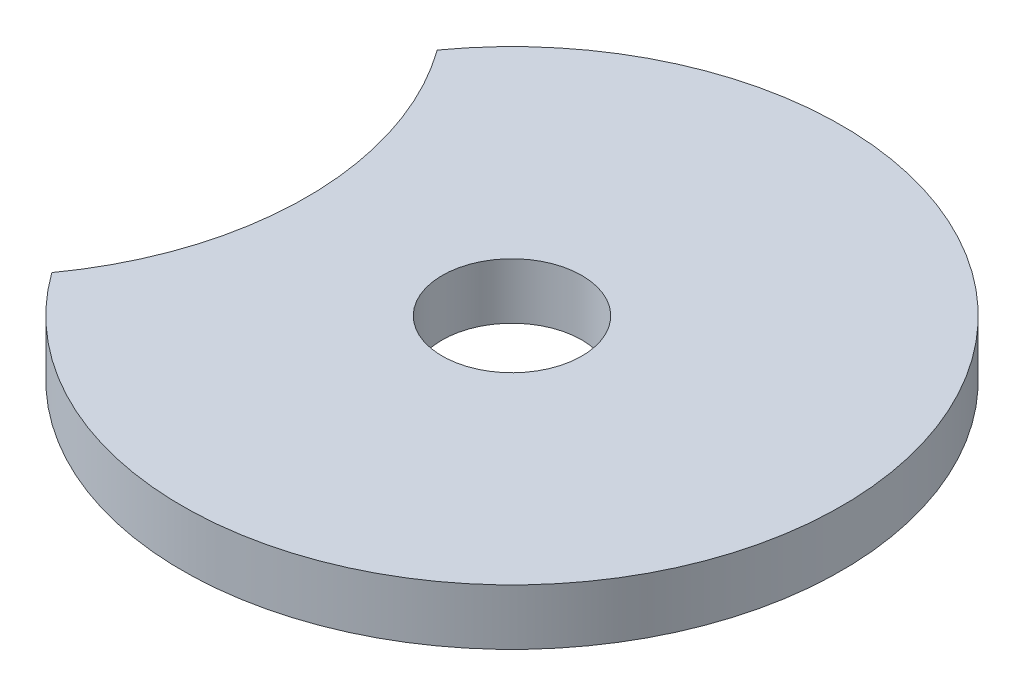
ISO-10303-21;
HEADER;
FILE_DESCRIPTION(('STEP AP214'),'2;1');
FILE_NAME('part.step','',(''),(''),'','','');
FILE_SCHEMA(('AUTOMOTIVE_DESIGN { 1 0 10303 214 1 1 1 1 }'));
ENDSEC;
DATA;
#1=APPLICATION_CONTEXT('core data for automotive mechanical design processes');
#2=APPLICATION_PROTOCOL_DEFINITION('international standard','automotive_design',2000,#1);
#3=PRODUCT_CONTEXT('',#1,'mechanical');
#4=PRODUCT('Part','Part','',(#3));
#5=PRODUCT_RELATED_PRODUCT_CATEGORY('part','',(#4));
#6=PRODUCT_DEFINITION_FORMATION('','',#4);
#7=PRODUCT_DEFINITION_CONTEXT('part definition',#1,'design');
#8=PRODUCT_DEFINITION('design','',#6,#7);
#9=PRODUCT_DEFINITION_SHAPE('','',#8);
#10=(LENGTH_UNIT() NAMED_UNIT(*) SI_UNIT(.MILLI.,.METRE.));
#11=(NAMED_UNIT(*) PLANE_ANGLE_UNIT() SI_UNIT($,.RADIAN.));
#12=(NAMED_UNIT(*) SI_UNIT($,.STERADIAN.) SOLID_ANGLE_UNIT());
#13=UNCERTAINTY_MEASURE_WITH_UNIT(LENGTH_MEASURE(1.E-05),#10,'distance_accuracy_value','');
#14=(GEOMETRIC_REPRESENTATION_CONTEXT(3) GLOBAL_UNCERTAINTY_ASSIGNED_CONTEXT((#13)) GLOBAL_UNIT_ASSIGNED_CONTEXT((#10,
#11,#12)) REPRESENTATION_CONTEXT('',''));
#15=CARTESIAN_POINT('',(0.,0.,0.));
#16=DIRECTION('',(0.,0.,1.));
#17=DIRECTION('',(1.,0.,0.));
#18=AXIS2_PLACEMENT_3D('',#15,#16,#17);
#19=CARTESIAN_POINT('',(-36.4778476717518,7.62,0.));
#20=DIRECTION('',(0.,-1.,0.));
#21=DIRECTION('',(0.,0.,-1.));
#22=AXIS2_PLACEMENT_3D('',#19,#20,#21);
#23=PLANE('',#22);
#24=CARTESIAN_POINT('',(-72.9556953435037,7.62,0.));
#25=DIRECTION('',(0.,-1.,0.));
#26=DIRECTION('',(0.,0.,-1.));
#27=AXIS2_PLACEMENT_3D('',#24,#25,#26);
#28=CIRCLE('',#27,44.958);
#29=CARTESIAN_POINT('',(-36.4778476717519,7.62,-26.2790485603354));
#30=VERTEX_POINT('',#29);
#31=CARTESIAN_POINT('',(-36.4778476717518,7.62,26.2790485603354));
#32=VERTEX_POINT('',#31);
#33=EDGE_CURVE('E66',#30,#32,#28,.T.);
#34=ORIENTED_EDGE('',*,*,#33,.T.);
#35=CARTESIAN_POINT('',(0.,7.62,0.));
#36=DIRECTION('',(0.,1.,0.));
#37=DIRECTION('',(0.,0.,1.));
#38=AXIS2_PLACEMENT_3D('',#35,#36,#37);
#39=CIRCLE('',#38,44.958);
#40=EDGE_CURVE('E51',#32,#30,#39,.T.);
#41=ORIENTED_EDGE('',*,*,#40,.T.);
#42=EDGE_LOOP('',(#34,#41));
#43=FACE_BOUND('',#42,.T.);
#44=CARTESIAN_POINT('',(0.,7.62,0.));
#45=DIRECTION('',(0.,1.,0.));
#46=DIRECTION('',(0.,0.,1.));
#47=AXIS2_PLACEMENT_3D('',#44,#45,#46);
#48=CIRCLE('',#47,9.525);
#49=CARTESIAN_POINT('',(0.,7.62,-9.525));
#50=VERTEX_POINT('',#49);
#51=EDGE_CURVE('E72',#50,#50,#48,.T.);
#52=ORIENTED_EDGE('',*,*,#51,.F.);
#53=EDGE_LOOP('',(#52));
#54=FACE_BOUND('',#53,.T.);
#55=ADVANCED_FACE('F35',(#43,#54),#23,.F.);
#56=CARTESIAN_POINT('',(-36.4778476717518,0.,0.));
#57=DIRECTION('',(0.,-1.,0.));
#58=DIRECTION('',(0.,0.,-1.));
#59=AXIS2_PLACEMENT_3D('',#56,#57,#58);
#60=PLANE('',#59);
#61=CARTESIAN_POINT('',(-72.9556953435037,0.,0.));
#62=DIRECTION('',(0.,-1.,0.));
#63=DIRECTION('',(0.,0.,-1.));
#64=AXIS2_PLACEMENT_3D('',#61,#62,#63);
#65=CIRCLE('',#64,44.958);
#66=CARTESIAN_POINT('',(-36.4778476717519,0.,-26.2790485603354));
#67=VERTEX_POINT('',#66);
#68=CARTESIAN_POINT('',(-36.4778476717518,0.,26.2790485603354));
#69=VERTEX_POINT('',#68);
#70=EDGE_CURVE('E67',#67,#69,#65,.T.);
#71=ORIENTED_EDGE('',*,*,#70,.F.);
#72=CARTESIAN_POINT('',(0.,0.,0.));
#73=DIRECTION('',(0.,1.,0.));
#74=DIRECTION('',(0.,0.,1.));
#75=AXIS2_PLACEMENT_3D('',#72,#73,#74);
#76=CIRCLE('',#75,44.958);
#77=EDGE_CURVE('E59',#69,#67,#76,.T.);
#78=ORIENTED_EDGE('',*,*,#77,.F.);
#79=EDGE_LOOP('',(#71,#78));
#80=FACE_BOUND('',#79,.T.);
#81=CARTESIAN_POINT('',(0.,0.,0.));
#82=DIRECTION('',(0.,1.,0.));
#83=DIRECTION('',(0.,0.,1.));
#84=AXIS2_PLACEMENT_3D('',#81,#82,#83);
#85=CIRCLE('',#84,9.525);
#86=CARTESIAN_POINT('',(0.,0.,-9.525));
#87=VERTEX_POINT('',#86);
#88=EDGE_CURVE('E75',#87,#87,#85,.T.);
#89=ORIENTED_EDGE('',*,*,#88,.T.);
#90=EDGE_LOOP('',(#89));
#91=FACE_BOUND('',#90,.T.);
#92=ADVANCED_FACE('F70',(#80,#91),#60,.T.);
#93=CARTESIAN_POINT('',(-72.9556953435037,7.62,0.));
#94=DIRECTION('',(0.,-1.,0.));
#95=DIRECTION('',(0.,0.,-1.));
#96=AXIS2_PLACEMENT_3D('',#93,#94,#95);
#97=CYLINDRICAL_SURFACE('',#96,44.958);
#98=ORIENTED_EDGE('',*,*,#70,.T.);
#99=DIRECTION('',(0.,-1.,0.));
#100=VECTOR('',#99,1.);
#101=CARTESIAN_POINT('',(-36.4778476717518,7.62,26.2790485603354));
#102=LINE('',#101,#100);
#103=EDGE_CURVE('E11',#32,#69,#102,.T.);
#104=ORIENTED_EDGE('',*,*,#103,.F.);
#105=ORIENTED_EDGE('',*,*,#33,.F.);
#106=DIRECTION('',(0.,-1.,0.));
#107=VECTOR('',#106,1.);
#108=CARTESIAN_POINT('',(-36.4778476717519,7.62,-26.2790485603354));
#109=LINE('',#108,#107);
#110=EDGE_CURVE('E44',#30,#67,#109,.T.);
#111=ORIENTED_EDGE('',*,*,#110,.T.);
#112=EDGE_LOOP('',(#98,#104,#105,#111));
#113=FACE_BOUND('',#112,.T.);
#114=ADVANCED_FACE('F37',(#113),#97,.F.);
#115=CARTESIAN_POINT('',(0.,7.62,0.));
#116=DIRECTION('',(0.,-1.,0.));
#117=DIRECTION('',(0.,0.,-1.));
#118=AXIS2_PLACEMENT_3D('',#115,#116,#117);
#119=CYLINDRICAL_SURFACE('',#118,44.958);
#120=ORIENTED_EDGE('',*,*,#77,.T.);
#121=ORIENTED_EDGE('',*,*,#110,.F.);
#122=ORIENTED_EDGE('',*,*,#40,.F.);
#123=ORIENTED_EDGE('',*,*,#103,.T.);
#124=EDGE_LOOP('',(#120,#121,#122,#123));
#125=FACE_BOUND('',#124,.T.);
#126=ADVANCED_FACE('F62',(#125),#119,.T.);
#127=CARTESIAN_POINT('',(0.,7.62,0.));
#128=DIRECTION('',(0.,-1.,0.));
#129=DIRECTION('',(0.,0.,-1.));
#130=AXIS2_PLACEMENT_3D('',#127,#128,#129);
#131=CYLINDRICAL_SURFACE('',#130,9.525);
#132=CARTESIAN_POINT('',(0.,7.62,-9.525));
#133=CARTESIAN_POINT('',(0.,7.540625,-9.525));
#134=CARTESIAN_POINT('',(0.,7.46125,-9.525));
#135=CARTESIAN_POINT('',(0.,7.3025,-9.525));
#136=CARTESIAN_POINT('',(0.,7.223125,-9.525));
#137=CARTESIAN_POINT('',(0.,7.064375,-9.525));
#138=CARTESIAN_POINT('',(0.,6.985,-9.525));
#139=CARTESIAN_POINT('',(0.,6.82625,-9.525));
#140=CARTESIAN_POINT('',(0.,6.746875,-9.525));
#141=CARTESIAN_POINT('',(0.,6.588125,-9.525));
#142=CARTESIAN_POINT('',(0.,6.50875,-9.525));
#143=CARTESIAN_POINT('',(0.,6.35,-9.525));
#144=CARTESIAN_POINT('',(0.,6.270625,-9.525));
#145=CARTESIAN_POINT('',(0.,6.111875,-9.525));
#146=CARTESIAN_POINT('',(0.,6.0325,-9.525));
#147=CARTESIAN_POINT('',(0.,5.87375,-9.525));
#148=CARTESIAN_POINT('',(0.,5.794375,-9.525));
#149=CARTESIAN_POINT('',(0.,5.635625,-9.525));
#150=CARTESIAN_POINT('',(0.,5.55625,-9.525));
#151=CARTESIAN_POINT('',(0.,5.3975,-9.525));
#152=CARTESIAN_POINT('',(0.,5.318125,-9.525));
#153=CARTESIAN_POINT('',(0.,5.159375,-9.525));
#154=CARTESIAN_POINT('',(0.,5.08,-9.525));
#155=CARTESIAN_POINT('',(0.,4.92125,-9.525));
#156=CARTESIAN_POINT('',(0.,4.841875,-9.525));
#157=CARTESIAN_POINT('',(0.,4.683125,-9.525));
#158=CARTESIAN_POINT('',(0.,4.60375,-9.525));
#159=CARTESIAN_POINT('',(0.,4.445,-9.525));
#160=CARTESIAN_POINT('',(0.,4.365625,-9.525));
#161=CARTESIAN_POINT('',(0.,4.206875,-9.525));
#162=CARTESIAN_POINT('',(0.,4.1275,-9.525));
#163=CARTESIAN_POINT('',(0.,3.96875,-9.525));
#164=CARTESIAN_POINT('',(0.,3.889375,-9.525));
#165=CARTESIAN_POINT('',(0.,3.730625,-9.525));
#166=CARTESIAN_POINT('',(0.,3.65125,-9.525));
#167=CARTESIAN_POINT('',(0.,3.4925,-9.525));
#168=CARTESIAN_POINT('',(0.,3.413125,-9.525));
#169=CARTESIAN_POINT('',(0.,3.254375,-9.525));
#170=CARTESIAN_POINT('',(0.,3.175,-9.525));
#171=CARTESIAN_POINT('',(0.,3.01625,-9.525));
#172=CARTESIAN_POINT('',(0.,2.936875,-9.525));
#173=CARTESIAN_POINT('',(0.,2.778125,-9.525));
#174=CARTESIAN_POINT('',(0.,2.69875,-9.525));
#175=CARTESIAN_POINT('',(0.,2.54,-9.525));
#176=CARTESIAN_POINT('',(0.,2.460625,-9.525));
#177=CARTESIAN_POINT('',(0.,2.301875,-9.525));
#178=CARTESIAN_POINT('',(0.,2.2225,-9.525));
#179=CARTESIAN_POINT('',(0.,2.06375,-9.525));
#180=CARTESIAN_POINT('',(0.,1.984375,-9.525));
#181=CARTESIAN_POINT('',(0.,1.825625,-9.525));
#182=CARTESIAN_POINT('',(0.,1.74625,-9.525));
#183=CARTESIAN_POINT('',(0.,1.5875,-9.525));
#184=CARTESIAN_POINT('',(0.,1.508125,-9.525));
#185=CARTESIAN_POINT('',(0.,1.349375,-9.525));
#186=CARTESIAN_POINT('',(0.,1.27,-9.525));
#187=CARTESIAN_POINT('',(0.,1.11125,-9.525));
#188=CARTESIAN_POINT('',(0.,1.031875,-9.525));
#189=CARTESIAN_POINT('',(0.,0.873125,-9.525));
#190=CARTESIAN_POINT('',(0.,0.79375,-9.525));
#191=CARTESIAN_POINT('',(0.,0.635,-9.525));
#192=CARTESIAN_POINT('',(0.,0.555625,-9.525));
#193=CARTESIAN_POINT('',(0.,0.396875,-9.525));
#194=CARTESIAN_POINT('',(0.,0.3175,-9.525));
#195=CARTESIAN_POINT('',(0.,0.15875,-9.525));
#196=CARTESIAN_POINT('',(0.,0.0793749999999999,-9.525));
#197=CARTESIAN_POINT('',(0.,0.,-9.525));
#198=B_SPLINE_CURVE_WITH_KNOTS('',3,(#132,#133,#134,#135,#136,#137,#138,#139,#140,#141,#142,
#143,#144,#145,#146,#147,#148,#149,#150,#151,#152,#153,#154,#155,#156,#157,#158,#159,#160,#161,
#162,#163,#164,#165,#166,#167,#168,#169,#170,#171,#172,#173,#174,#175,#176,#177,#178,#179,#180,
#181,#182,#183,#184,#185,#186,#187,#188,#189,#190,#191,#192,#193,#194,#195,#196,#197),
.UNSPECIFIED.,.F.,.F.,(4,2,2,2,2,2,2,2,2,2,2,2,2,2,2,2,2,2,2,2,2,2,2,2,2,2,2,2,2,2,2,2,4),(0.,
0.238125,0.476249999999999,0.714375,0.952499999999999,1.190625,1.42875,1.666875,1.905,2.143125,
2.38125,2.619375,2.8575,3.095625,3.33375,3.571875,3.81,4.048125,4.28625,4.524375,4.7625,
5.000625,5.23875,5.476875,5.715,5.953125,6.19125,6.429375,6.6675,6.905625,7.14375,7.381875,
7.62),.UNSPECIFIED.);
#199=EDGE_CURVE('BSEAM83',#50,#87,#198,.T.);
#200=ORIENTED_EDGE('',*,*,#51,.T.);
#201=ORIENTED_EDGE('',*,*,#88,.F.);
#202=ORIENTED_EDGE('',*,*,#199,.T.);
#203=ORIENTED_EDGE('',*,*,#199,.F.);
#204=EDGE_LOOP('',(#200,#202,#201,#203));
#205=FACE_BOUND('',#204,.T.);
#206=ADVANCED_FACE('F83',(#205),#131,.F.);
#207=CLOSED_SHELL('',(#55,#92,#114,#126,#206));
#208=MANIFOLD_SOLID_BREP('B2',#207);
#209=ADVANCED_BREP_SHAPE_REPRESENTATION('',(#18,#208),#14);
#210=SHAPE_DEFINITION_REPRESENTATION(#9,#209);
ENDSEC;
END-ISO-10303-21;
